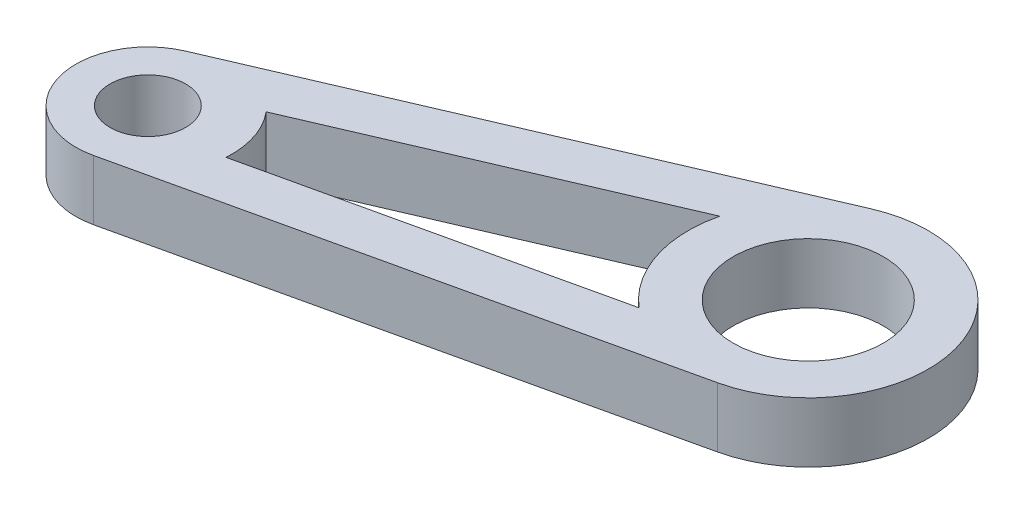
ISO-10303-21;
HEADER;
FILE_DESCRIPTION(('STEP AP214'),'2;1');
FILE_NAME('part.step','',(''),(''),'','','');
FILE_SCHEMA(('AUTOMOTIVE_DESIGN { 1 0 10303 214 1 1 1 1 }'));
ENDSEC;
DATA;
#1=APPLICATION_CONTEXT('core data for automotive mechanical design processes');
#2=APPLICATION_PROTOCOL_DEFINITION('international standard','automotive_design',2000,#1);
#3=PRODUCT_CONTEXT('',#1,'mechanical');
#4=PRODUCT('Part','Part','',(#3));
#5=PRODUCT_RELATED_PRODUCT_CATEGORY('part','',(#4));
#6=PRODUCT_DEFINITION_FORMATION('','',#4);
#7=PRODUCT_DEFINITION_CONTEXT('part definition',#1,'design');
#8=PRODUCT_DEFINITION('design','',#6,#7);
#9=PRODUCT_DEFINITION_SHAPE('','',#8);
#10=(LENGTH_UNIT() NAMED_UNIT(*) SI_UNIT(.MILLI.,.METRE.));
#11=(NAMED_UNIT(*) PLANE_ANGLE_UNIT() SI_UNIT($,.RADIAN.));
#12=(NAMED_UNIT(*) SI_UNIT($,.STERADIAN.) SOLID_ANGLE_UNIT());
#13=UNCERTAINTY_MEASURE_WITH_UNIT(LENGTH_MEASURE(1.E-05),#10,'distance_accuracy_value','');
#14=(GEOMETRIC_REPRESENTATION_CONTEXT(3) GLOBAL_UNCERTAINTY_ASSIGNED_CONTEXT((#13)) GLOBAL_UNIT_ASSIGNED_CONTEXT((#10,
#11,#12)) REPRESENTATION_CONTEXT('',''));
#15=CARTESIAN_POINT('',(0.,0.,0.));
#16=DIRECTION('',(0.,0.,1.));
#17=DIRECTION('',(1.,0.,0.));
#18=AXIS2_PLACEMENT_3D('',#15,#16,#17);
#19=CARTESIAN_POINT('',(0.,-3.175,0.));
#20=DIRECTION('',(0.,1.,0.));
#21=DIRECTION('',(0.,0.,1.));
#22=AXIS2_PLACEMENT_3D('',#19,#20,#21);
#23=CYLINDRICAL_SURFACE('',#22,6.35);
#24=CARTESIAN_POINT('',(0.,0.,0.));
#25=DIRECTION('',(0.,1.,0.));
#26=DIRECTION('',(0.,0.,-1.));
#27=AXIS2_PLACEMENT_3D('',#24,#25,#26);
#28=CIRCLE('',#27,6.35);
#29=CARTESIAN_POINT('',(1.40209469371994,0.,6.19327300139776));
#30=VERTEX_POINT('',#29);
#31=CARTESIAN_POINT('',(-2.50870962759497,0.,-5.83342746628534));
#32=VERTEX_POINT('',#31);
#33=EDGE_CURVE('E147',#30,#32,#28,.T.);
#34=ORIENTED_EDGE('',*,*,#33,.F.);
#35=DIRECTION('',(0.,1.,0.));
#36=VECTOR('',#35,1.);
#37=CARTESIAN_POINT('',(1.40209469371994,-3.175,6.19327300139776));
#38=LINE('',#37,#36);
#39=CARTESIAN_POINT('',(1.40209469371994,-3.175,6.19327300139776));
#40=VERTEX_POINT('',#39);
#41=EDGE_CURVE('E11',#40,#30,#38,.T.);
#42=ORIENTED_EDGE('',*,*,#41,.F.);
#43=CARTESIAN_POINT('',(0.,-3.175,0.));
#44=DIRECTION('',(0.,1.,0.));
#45=DIRECTION('',(0.,0.,-1.));
#46=AXIS2_PLACEMENT_3D('',#43,#44,#45);
#47=CIRCLE('',#46,6.35);
#48=CARTESIAN_POINT('',(-2.50870962759497,-3.175,-5.83342746628534));
#49=VERTEX_POINT('',#48);
#50=EDGE_CURVE('E150',#40,#49,#47,.T.);
#51=ORIENTED_EDGE('',*,*,#50,.T.);
#52=DIRECTION('',(0.,1.,0.));
#53=VECTOR('',#52,1.);
#54=CARTESIAN_POINT('',(-2.50870962759497,-3.175,-5.83342746628534));
#55=LINE('',#54,#53);
#56=EDGE_CURVE('E39',#49,#32,#55,.T.);
#57=ORIENTED_EDGE('',*,*,#56,.T.);
#58=EDGE_LOOP('',(#34,#42,#51,#57));
#59=FACE_BOUND('',#58,.T.);
#60=ADVANCED_FACE('F36',(#59),#23,.T.);
#61=CARTESIAN_POINT('',(1.40209469371994,-3.175,6.19327300139776));
#62=DIRECTION('',(0.220802313971644,0.,0.975318582897285));
#63=DIRECTION('',(0.975318582897285,0.,-0.220802313971644));
#64=AXIS2_PLACEMENT_3D('',#61,#62,#63);
#65=PLANE('',#64);
#66=DIRECTION('',(0.975318582897285,0.,-0.220802313971644));
#67=VECTOR('',#66,1.);
#68=CARTESIAN_POINT('',(1.40209469371994,0.,6.19327300139776));
#69=LINE('',#68,#67);
#70=CARTESIAN_POINT('',(-25.521322665768,0.,12.2884638008387));
#71=VERTEX_POINT('',#70);
#72=EDGE_CURVE('E154',#71,#30,#69,.T.);
#73=ORIENTED_EDGE('',*,*,#72,.F.);
#74=DIRECTION('',(0.,1.,0.));
#75=VECTOR('',#74,1.);
#76=CARTESIAN_POINT('',(-25.521322665768,-3.175,12.2884638008387));
#77=LINE('',#76,#75);
#78=CARTESIAN_POINT('',(-25.521322665768,-3.175,12.2884638008387));
#79=VERTEX_POINT('',#78);
#80=EDGE_CURVE('E44',#79,#71,#77,.T.);
#81=ORIENTED_EDGE('',*,*,#80,.F.);
#82=DIRECTION('',(0.975318582897285,0.,-0.220802313971644));
#83=VECTOR('',#82,1.);
#84=CARTESIAN_POINT('',(1.40209469371994,-3.175,6.19327300139776));
#85=LINE('',#84,#83);
#86=EDGE_CURVE('E160',#79,#40,#85,.T.);
#87=ORIENTED_EDGE('',*,*,#86,.T.);
#88=ORIENTED_EDGE('',*,*,#41,.T.);
#89=EDGE_LOOP('',(#73,#81,#87,#88));
#90=FACE_BOUND('',#89,.T.);
#91=ADVANCED_FACE('F186',(#90),#65,.T.);
#92=CARTESIAN_POINT('',(-26.362579482,-3.175,8.5725));
#93=DIRECTION('',(0.,1.,0.));
#94=DIRECTION('',(0.,0.,1.));
#95=AXIS2_PLACEMENT_3D('',#92,#93,#94);
#96=CYLINDRICAL_SURFACE('',#95,3.81);
#97=CARTESIAN_POINT('',(-26.362579482,0.,8.5725));
#98=DIRECTION('',(0.,1.,0.));
#99=DIRECTION('',(0.,0.,-1.));
#100=AXIS2_PLACEMENT_3D('',#97,#98,#99);
#101=CIRCLE('',#100,3.81);
#102=CARTESIAN_POINT('',(-27.867805258557,0.,5.07244352022879));
#103=VERTEX_POINT('',#102);
#104=EDGE_CURVE('E168',#103,#71,#101,.T.);
#105=ORIENTED_EDGE('',*,*,#104,.F.);
#106=DIRECTION('',(0.,1.,0.));
#107=VECTOR('',#106,1.);
#108=CARTESIAN_POINT('',(-27.867805258557,-3.175,5.07244352022879));
#109=LINE('',#108,#107);
#110=CARTESIAN_POINT('',(-27.867805258557,-3.175,5.07244352022879));
#111=VERTEX_POINT('',#110);
#112=EDGE_CURVE('E173',#111,#103,#109,.T.);
#113=ORIENTED_EDGE('',*,*,#112,.F.);
#114=CARTESIAN_POINT('',(-26.362579482,-3.175,8.5725));
#115=DIRECTION('',(0.,1.,0.));
#116=DIRECTION('',(0.,0.,-1.));
#117=AXIS2_PLACEMENT_3D('',#114,#115,#116);
#118=CIRCLE('',#117,3.81);
#119=EDGE_CURVE('E157',#111,#79,#118,.T.);
#120=ORIENTED_EDGE('',*,*,#119,.T.);
#121=ORIENTED_EDGE('',*,*,#80,.T.);
#122=EDGE_LOOP('',(#105,#113,#120,#121));
#123=FACE_BOUND('',#122,.T.);
#124=ADVANCED_FACE('F191',(#123),#96,.T.);
#125=CARTESIAN_POINT('',(-2.50870962759497,-3.175,-5.83342746628534));
#126=DIRECTION('',(-0.395072382298421,0.,-0.918649994690606));
#127=DIRECTION('',(-0.918649994690606,0.,0.395072382298421));
#128=AXIS2_PLACEMENT_3D('',#125,#126,#127);
#129=PLANE('',#128);
#130=DIRECTION('',(-0.918649994690606,0.,0.395072382298421));
#131=VECTOR('',#130,1.);
#132=CARTESIAN_POINT('',(-2.50870962759497,0.,-5.83342746628534));
#133=LINE('',#132,#131);
#134=EDGE_CURVE('E165',#32,#103,#133,.T.);
#135=ORIENTED_EDGE('',*,*,#134,.F.);
#136=ORIENTED_EDGE('',*,*,#56,.F.);
#137=DIRECTION('',(-0.918649994690606,0.,0.395072382298421));
#138=VECTOR('',#137,1.);
#139=CARTESIAN_POINT('',(-2.50870962759497,-3.175,-5.83342746628534));
#140=LINE('',#139,#138);
#141=EDGE_CURVE('E153',#49,#111,#140,.T.);
#142=ORIENTED_EDGE('',*,*,#141,.T.);
#143=ORIENTED_EDGE('',*,*,#112,.T.);
#144=EDGE_LOOP('',(#135,#136,#142,#143));
#145=FACE_BOUND('',#144,.T.);
#146=ADVANCED_FACE('F181',(#145),#129,.T.);
#147=CARTESIAN_POINT('',(0.,-3.175,0.));
#148=DIRECTION('',(0.,-1.,0.));
#149=DIRECTION('',(0.,0.,-1.));
#150=AXIS2_PLACEMENT_3D('',#147,#148,#149);
#151=PLANE('',#150);
#152=CARTESIAN_POINT('',(-26.362579482,-3.175,8.5725));
#153=DIRECTION('',(0.,-1.,0.));
#154=DIRECTION('',(0.,0.,-1.));
#155=AXIS2_PLACEMENT_3D('',#152,#153,#154);
#156=CIRCLE('',#155,4.445);
#157=CARTESIAN_POINT('',(-22.9511393005905,-3.175,5.72292092780977));
#158=VERTEX_POINT('',#157);
#159=CARTESIAN_POINT('',(-21.9275867129541,-3.175,8.87060088646469));
#160=VERTEX_POINT('',#159);
#161=EDGE_CURVE('E103',#158,#160,#156,.T.);
#162=ORIENTED_EDGE('',*,*,#161,.T.);
#163=DIRECTION('',(0.975318582897285,0.,-0.220802313971644));
#164=VECTOR('',#163,1.);
#165=CARTESIAN_POINT('',(-4.11336158488624,-3.175,4.8376395558146));
#166=LINE('',#165,#164);
#167=CARTESIAN_POINT('',(-4.11336158488624,-3.175,4.8376395558146));
#168=VERTEX_POINT('',#167);
#169=EDGE_CURVE('E112',#160,#168,#166,.T.);
#170=ORIENTED_EDGE('',*,*,#169,.T.);
#171=CARTESIAN_POINT('',(0.,-3.175,0.));
#172=DIRECTION('',(0.,-1.,0.));
#173=DIRECTION('',(0.,0.,-1.));
#174=AXIS2_PLACEMENT_3D('',#171,#172,#173);
#175=CIRCLE('',#174,6.35);
#176=CARTESIAN_POINT('',(-6.17196774958526,-3.175,-1.49308877769523));
#177=VERTEX_POINT('',#176);
#178=EDGE_CURVE('E52',#168,#177,#175,.T.);
#179=ORIENTED_EDGE('',*,*,#178,.T.);
#180=DIRECTION('',(-0.918649994690606,0.,0.395072382298421));
#181=VECTOR('',#180,1.);
#182=CARTESIAN_POINT('',(-6.17196774958526,-3.175,-1.49308877769523));
#183=LINE('',#182,#181);
#184=EDGE_CURVE('E109',#177,#158,#183,.T.);
#185=ORIENTED_EDGE('',*,*,#184,.T.);
#186=EDGE_LOOP('',(#162,#170,#179,#185));
#187=FACE_BOUND('',#186,.T.);
#188=CARTESIAN_POINT('',(-26.362579482,-3.175,8.5725));
#189=DIRECTION('',(0.,1.,0.));
#190=DIRECTION('',(0.,0.,1.));
#191=AXIS2_PLACEMENT_3D('',#188,#189,#190);
#192=CIRCLE('',#191,2.);
#193=CARTESIAN_POINT('',(-26.362579482,-3.175,10.5725));
#194=VERTEX_POINT('',#193);
#195=EDGE_CURVE('E138',#194,#194,#192,.T.);
#196=ORIENTED_EDGE('',*,*,#195,.T.);
#197=EDGE_LOOP('',(#196));
#198=FACE_BOUND('',#197,.T.);
#199=CARTESIAN_POINT('',(0.,-3.175,0.));
#200=DIRECTION('',(0.,1.,0.));
#201=DIRECTION('',(0.,0.,1.));
#202=AXIS2_PLACEMENT_3D('',#199,#200,#201);
#203=CIRCLE('',#202,3.96875);
#204=CARTESIAN_POINT('',(0.,-3.175,3.96875));
#205=VERTEX_POINT('',#204);
#206=EDGE_CURVE('E144',#205,#205,#203,.T.);
#207=ORIENTED_EDGE('',*,*,#206,.T.);
#208=EDGE_LOOP('',(#207));
#209=FACE_BOUND('',#208,.T.);
#210=ORIENTED_EDGE('',*,*,#50,.F.);
#211=ORIENTED_EDGE('',*,*,#86,.F.);
#212=ORIENTED_EDGE('',*,*,#119,.F.);
#213=ORIENTED_EDGE('',*,*,#141,.F.);
#214=EDGE_LOOP('',(#210,#211,#212,#213));
#215=FACE_BOUND('',#214,.T.);
#216=ADVANCED_FACE('F116',(#187,#198,#209,#215),#151,.T.);
#217=CARTESIAN_POINT('',(0.,0.,0.));
#218=DIRECTION('',(0.,-1.,0.));
#219=DIRECTION('',(0.,0.,-1.));
#220=AXIS2_PLACEMENT_3D('',#217,#218,#219);
#221=PLANE('',#220);
#222=DIRECTION('',(0.975318582897285,0.,-0.220802313971644));
#223=VECTOR('',#222,1.);
#224=CARTESIAN_POINT('',(-4.11336158488624,0.,4.8376395558146));
#225=LINE('',#224,#223);
#226=CARTESIAN_POINT('',(-21.9275867129542,0.,8.8706008864647));
#227=VERTEX_POINT('',#226);
#228=CARTESIAN_POINT('',(-4.11336158488624,0.,4.83763955581461));
#229=VERTEX_POINT('',#228);
#230=EDGE_CURVE('E128',#227,#229,#225,.T.);
#231=ORIENTED_EDGE('',*,*,#230,.F.);
#232=CARTESIAN_POINT('',(-26.362579482,0.,8.5725));
#233=DIRECTION('',(0.,-1.,0.));
#234=DIRECTION('',(0.,0.,-1.));
#235=AXIS2_PLACEMENT_3D('',#232,#233,#234);
#236=CIRCLE('',#235,4.445);
#237=CARTESIAN_POINT('',(-22.9511393005905,0.,5.72292092780977));
#238=VERTEX_POINT('',#237);
#239=EDGE_CURVE('E60',#238,#227,#236,.T.);
#240=ORIENTED_EDGE('',*,*,#239,.F.);
#241=DIRECTION('',(-0.918649994690606,0.,0.395072382298421));
#242=VECTOR('',#241,1.);
#243=CARTESIAN_POINT('',(-6.17196774958526,0.,-1.49308877769523));
#244=LINE('',#243,#242);
#245=CARTESIAN_POINT('',(-6.17196774958526,0.,-1.49308877769523));
#246=VERTEX_POINT('',#245);
#247=EDGE_CURVE('E119',#246,#238,#244,.T.);
#248=ORIENTED_EDGE('',*,*,#247,.F.);
#249=CARTESIAN_POINT('',(0.,0.,0.));
#250=DIRECTION('',(0.,-1.,0.));
#251=DIRECTION('',(0.,0.,-1.));
#252=AXIS2_PLACEMENT_3D('',#249,#250,#251);
#253=CIRCLE('',#252,6.35);
#254=EDGE_CURVE('E122',#229,#246,#253,.T.);
#255=ORIENTED_EDGE('',*,*,#254,.F.);
#256=EDGE_LOOP('',(#231,#240,#248,#255));
#257=FACE_BOUND('',#256,.T.);
#258=CARTESIAN_POINT('',(-26.362579482,0.,8.5725));
#259=DIRECTION('',(0.,1.,0.));
#260=DIRECTION('',(0.,0.,1.));
#261=AXIS2_PLACEMENT_3D('',#258,#259,#260);
#262=CIRCLE('',#261,2.);
#263=CARTESIAN_POINT('',(-26.362579482,0.,10.5725));
#264=VERTEX_POINT('',#263);
#265=EDGE_CURVE('E134',#264,#264,#262,.T.);
#266=ORIENTED_EDGE('',*,*,#265,.F.);
#267=EDGE_LOOP('',(#266));
#268=FACE_BOUND('',#267,.T.);
#269=CARTESIAN_POINT('',(0.,0.,0.));
#270=DIRECTION('',(0.,1.,0.));
#271=DIRECTION('',(0.,0.,1.));
#272=AXIS2_PLACEMENT_3D('',#269,#270,#271);
#273=CIRCLE('',#272,3.96875);
#274=CARTESIAN_POINT('',(0.,0.,3.96875));
#275=VERTEX_POINT('',#274);
#276=EDGE_CURVE('E141',#275,#275,#273,.T.);
#277=ORIENTED_EDGE('',*,*,#276,.F.);
#278=EDGE_LOOP('',(#277));
#279=FACE_BOUND('',#278,.T.);
#280=ORIENTED_EDGE('',*,*,#33,.T.);
#281=ORIENTED_EDGE('',*,*,#134,.T.);
#282=ORIENTED_EDGE('',*,*,#104,.T.);
#283=ORIENTED_EDGE('',*,*,#72,.T.);
#284=EDGE_LOOP('',(#280,#281,#282,#283));
#285=FACE_BOUND('',#284,.T.);
#286=ADVANCED_FACE('F183',(#257,#268,#279,#285),#221,.F.);
#287=CARTESIAN_POINT('',(0.,-3.175,0.));
#288=DIRECTION('',(0.,1.,0.));
#289=DIRECTION('',(0.,0.,1.));
#290=AXIS2_PLACEMENT_3D('',#287,#288,#289);
#291=CYLINDRICAL_SURFACE('',#290,3.96875);
#292=ORIENTED_EDGE('',*,*,#206,.F.);
#293=EDGE_LOOP('',(#292));
#294=FACE_BOUND('',#293,.T.);
#295=ORIENTED_EDGE('',*,*,#276,.T.);
#296=EDGE_LOOP('',(#295));
#297=FACE_BOUND('',#296,.T.);
#298=ADVANCED_FACE('F233',(#294,#297),#291,.F.);
#299=CARTESIAN_POINT('',(-26.362579482,-3.175,8.5725));
#300=DIRECTION('',(0.,1.,0.));
#301=DIRECTION('',(0.,0.,1.));
#302=AXIS2_PLACEMENT_3D('',#299,#300,#301);
#303=CYLINDRICAL_SURFACE('',#302,2.);
#304=ORIENTED_EDGE('',*,*,#195,.F.);
#305=EDGE_LOOP('',(#304));
#306=FACE_BOUND('',#305,.T.);
#307=ORIENTED_EDGE('',*,*,#265,.T.);
#308=EDGE_LOOP('',(#307));
#309=FACE_BOUND('',#308,.T.);
#310=ADVANCED_FACE('F243',(#306,#309),#303,.F.);
#311=CARTESIAN_POINT('',(-26.362579482,-3.175,8.5725));
#312=DIRECTION('',(0.,1.,0.));
#313=DIRECTION('',(0.,0.,1.));
#314=AXIS2_PLACEMENT_3D('',#311,#312,#313);
#315=CYLINDRICAL_SURFACE('',#314,4.445);
#316=ORIENTED_EDGE('',*,*,#239,.T.);
#317=DIRECTION('',(0.,1.,0.));
#318=VECTOR('',#317,1.);
#319=CARTESIAN_POINT('',(-21.9275867129541,-3.175,8.87060088646469));
#320=LINE('',#319,#318);
#321=EDGE_CURVE('E99',#160,#227,#320,.T.);
#322=ORIENTED_EDGE('',*,*,#321,.F.);
#323=ORIENTED_EDGE('',*,*,#161,.F.);
#324=DIRECTION('',(0.,1.,0.));
#325=VECTOR('',#324,1.);
#326=CARTESIAN_POINT('',(-22.9511393005905,-3.175,5.72292092780977));
#327=LINE('',#326,#325);
#328=EDGE_CURVE('E132',#158,#238,#327,.T.);
#329=ORIENTED_EDGE('',*,*,#328,.T.);
#330=EDGE_LOOP('',(#316,#322,#323,#329));
#331=FACE_BOUND('',#330,.T.);
#332=ADVANCED_FACE('F101',(#331),#315,.T.);
#333=CARTESIAN_POINT('',(-6.17196774958526,-3.175,-1.49308877769523));
#334=DIRECTION('',(-0.395072382298421,0.,-0.918649994690606));
#335=DIRECTION('',(-0.918649994690606,0.,0.395072382298421));
#336=AXIS2_PLACEMENT_3D('',#333,#334,#335);
#337=PLANE('',#336);
#338=ORIENTED_EDGE('',*,*,#247,.T.);
#339=ORIENTED_EDGE('',*,*,#328,.F.);
#340=ORIENTED_EDGE('',*,*,#184,.F.);
#341=DIRECTION('',(0.,1.,0.));
#342=VECTOR('',#341,1.);
#343=CARTESIAN_POINT('',(-6.17196774958526,-3.175,-1.49308877769523));
#344=LINE('',#343,#342);
#345=EDGE_CURVE('E135',#177,#246,#344,.T.);
#346=ORIENTED_EDGE('',*,*,#345,.T.);
#347=EDGE_LOOP('',(#338,#339,#340,#346));
#348=FACE_BOUND('',#347,.T.);
#349=ADVANCED_FACE('F262',(#348),#337,.F.);
#350=CARTESIAN_POINT('',(0.,-3.175,0.));
#351=DIRECTION('',(0.,1.,0.));
#352=DIRECTION('',(0.,0.,1.));
#353=AXIS2_PLACEMENT_3D('',#350,#351,#352);
#354=CYLINDRICAL_SURFACE('',#353,6.35);
#355=ORIENTED_EDGE('',*,*,#254,.T.);
#356=ORIENTED_EDGE('',*,*,#345,.F.);
#357=ORIENTED_EDGE('',*,*,#178,.F.);
#358=DIRECTION('',(0.,1.,0.));
#359=VECTOR('',#358,1.);
#360=CARTESIAN_POINT('',(-4.11336158488624,-3.175,4.83763955581461));
#361=LINE('',#360,#359);
#362=EDGE_CURVE('E108',#168,#229,#361,.T.);
#363=ORIENTED_EDGE('',*,*,#362,.T.);
#364=EDGE_LOOP('',(#355,#356,#357,#363));
#365=FACE_BOUND('',#364,.T.);
#366=ADVANCED_FACE('F271',(#365),#354,.T.);
#367=CARTESIAN_POINT('',(-4.11336158488624,-3.175,4.8376395558146));
#368=DIRECTION('',(0.220802313971644,0.,0.975318582897285));
#369=DIRECTION('',(0.975318582897285,0.,-0.220802313971644));
#370=AXIS2_PLACEMENT_3D('',#367,#368,#369);
#371=PLANE('',#370);
#372=ORIENTED_EDGE('',*,*,#230,.T.);
#373=ORIENTED_EDGE('',*,*,#362,.F.);
#374=ORIENTED_EDGE('',*,*,#169,.F.);
#375=ORIENTED_EDGE('',*,*,#321,.T.);
#376=EDGE_LOOP('',(#372,#373,#374,#375));
#377=FACE_BOUND('',#376,.T.);
#378=ADVANCED_FACE('F113',(#377),#371,.F.);
#379=CLOSED_SHELL('',(#60,#91,#124,#146,#216,#286,#298,#310,#332,#349,#366,#378));
#380=MANIFOLD_SOLID_BREP('B2',#379);
#381=ADVANCED_BREP_SHAPE_REPRESENTATION('',(#18,#380),#14);
#382=SHAPE_DEFINITION_REPRESENTATION(#9,#381);
ENDSEC;
END-ISO-10303-21;
